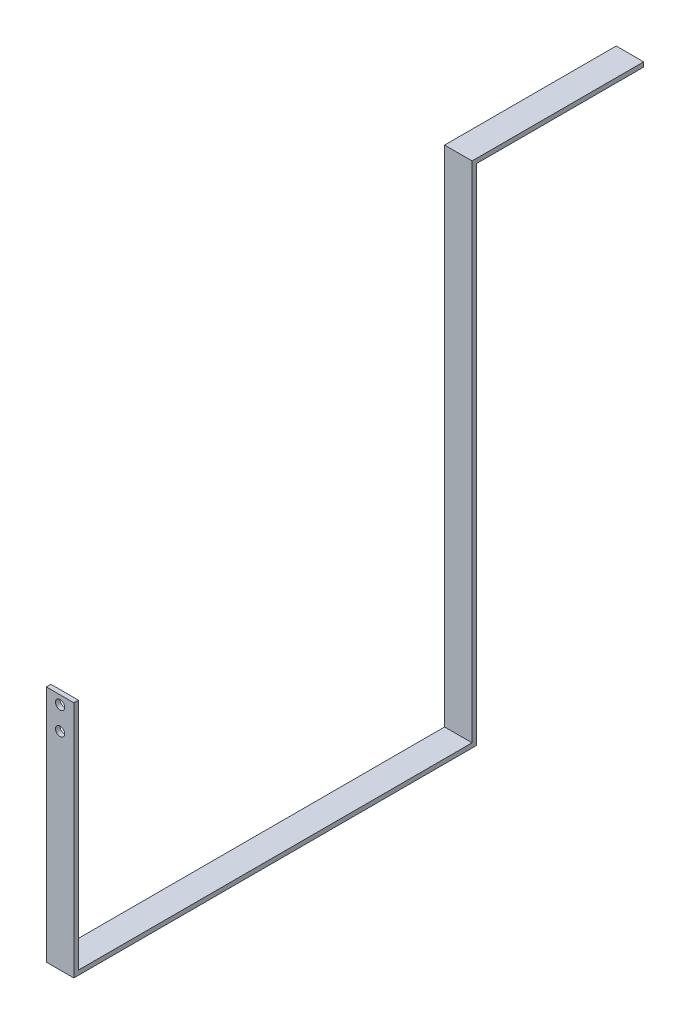
ISO-10303-21;
HEADER;
FILE_DESCRIPTION(('STEP AP214'),'2;1');
FILE_NAME('part.step','',(''),(''),'','','');
FILE_SCHEMA(('AUTOMOTIVE_DESIGN { 1 0 10303 214 1 1 1 1 }'));
ENDSEC;
DATA;
#1=APPLICATION_CONTEXT('core data for automotive mechanical design processes');
#2=APPLICATION_PROTOCOL_DEFINITION('international standard','automotive_design',2000,#1);
#3=PRODUCT_CONTEXT('',#1,'mechanical');
#4=PRODUCT('Part','Part','',(#3));
#5=PRODUCT_RELATED_PRODUCT_CATEGORY('part','',(#4));
#6=PRODUCT_DEFINITION_FORMATION('','',#4);
#7=PRODUCT_DEFINITION_CONTEXT('part definition',#1,'design');
#8=PRODUCT_DEFINITION('design','',#6,#7);
#9=PRODUCT_DEFINITION_SHAPE('','',#8);
#10=(LENGTH_UNIT() NAMED_UNIT(*) SI_UNIT(.MILLI.,.METRE.));
#11=(NAMED_UNIT(*) PLANE_ANGLE_UNIT() SI_UNIT($,.RADIAN.));
#12=(NAMED_UNIT(*) SI_UNIT($,.STERADIAN.) SOLID_ANGLE_UNIT());
#13=UNCERTAINTY_MEASURE_WITH_UNIT(LENGTH_MEASURE(1.E-05),#10,'distance_accuracy_value','');
#14=(GEOMETRIC_REPRESENTATION_CONTEXT(3) GLOBAL_UNCERTAINTY_ASSIGNED_CONTEXT((#13)) GLOBAL_UNIT_ASSIGNED_CONTEXT((#10,
#11,#12)) REPRESENTATION_CONTEXT('',''));
#15=CARTESIAN_POINT('',(0.,0.,0.));
#16=DIRECTION('',(0.,0.,1.));
#17=DIRECTION('',(1.,0.,0.));
#18=AXIS2_PLACEMENT_3D('',#15,#16,#17);
#19=CARTESIAN_POINT('',(19.05,-695.945,790.55));
#20=DIRECTION('',(0.,-1.,0.));
#21=DIRECTION('',(0.,0.,-1.));
#22=AXIS2_PLACEMENT_3D('',#19,#20,#21);
#23=PLANE('',#22);
#24=DIRECTION('',(-1.,0.,0.));
#25=VECTOR('',#24,1.);
#26=CARTESIAN_POINT('',(19.05,-695.945,784.24));
#27=LINE('',#26,#25);
#28=CARTESIAN_POINT('',(19.05,-695.945,784.24));
#29=VERTEX_POINT('',#28);
#30=CARTESIAN_POINT('',(-19.05,-695.945,784.24));
#31=VERTEX_POINT('',#30);
#32=EDGE_CURVE('E143',#29,#31,#27,.T.);
#33=ORIENTED_EDGE('',*,*,#32,.F.);
#34=DIRECTION('',(0.,0.,-1.));
#35=VECTOR('',#34,1.);
#36=CARTESIAN_POINT('',(19.05,-695.945,790.55));
#37=LINE('',#36,#35);
#38=CARTESIAN_POINT('',(19.05,-695.945,238.05));
#39=VERTEX_POINT('',#38);
#40=EDGE_CURVE('E50',#29,#39,#37,.T.);
#41=ORIENTED_EDGE('',*,*,#40,.T.);
#42=DIRECTION('',(-1.,0.,0.));
#43=VECTOR('',#42,1.);
#44=CARTESIAN_POINT('',(19.05,-695.945,238.05));
#45=LINE('',#44,#43);
#46=CARTESIAN_POINT('',(-19.05,-695.945,238.05));
#47=VERTEX_POINT('',#46);
#48=EDGE_CURVE('E128',#39,#47,#45,.T.);
#49=ORIENTED_EDGE('',*,*,#48,.T.);
#50=DIRECTION('',(0.,0.,-1.));
#51=VECTOR('',#50,1.);
#52=CARTESIAN_POINT('',(-19.05,-695.945,790.55));
#53=LINE('',#52,#51);
#54=EDGE_CURVE('E159',#31,#47,#53,.T.);
#55=ORIENTED_EDGE('',*,*,#54,.F.);
#56=EDGE_LOOP('',(#33,#41,#49,#55));
#57=FACE_BOUND('',#56,.T.);
#58=ADVANCED_FACE('F35',(#57),#23,.F.);
#59=CARTESIAN_POINT('',(0.,0.,238.05));
#60=DIRECTION('',(0.,0.,-1.));
#61=DIRECTION('',(-1.,0.,0.));
#62=AXIS2_PLACEMENT_3D('',#59,#60,#61);
#63=PLANE('',#62);
#64=ORIENTED_EDGE('',*,*,#48,.F.);
#65=DIRECTION('',(0.,1.,0.));
#66=VECTOR('',#65,1.);
#67=CARTESIAN_POINT('',(19.05,-3.155,238.05));
#68=LINE('',#67,#66);
#69=CARTESIAN_POINT('',(19.05,3.155,238.05));
#70=VERTEX_POINT('',#69);
#71=EDGE_CURVE('E176',#39,#70,#68,.T.);
#72=ORIENTED_EDGE('',*,*,#71,.T.);
#73=DIRECTION('',(-1.,0.,0.));
#74=VECTOR('',#73,1.);
#75=CARTESIAN_POINT('',(-19.05,3.155,238.05));
#76=LINE('',#75,#74);
#77=CARTESIAN_POINT('',(-19.05,3.155,238.05));
#78=VERTEX_POINT('',#77);
#79=EDGE_CURVE('E178',#70,#78,#76,.T.);
#80=ORIENTED_EDGE('',*,*,#79,.T.);
#81=DIRECTION('',(0.,-1.,0.));
#82=VECTOR('',#81,1.);
#83=CARTESIAN_POINT('',(-19.05,-3.155,238.05));
#84=LINE('',#83,#82);
#85=EDGE_CURVE('E181',#78,#47,#84,.T.);
#86=ORIENTED_EDGE('',*,*,#85,.T.);
#87=EDGE_LOOP('',(#64,#72,#80,#86));
#88=FACE_BOUND('',#87,.T.);
#89=ADVANCED_FACE('F219',(#88),#63,.F.);
#90=CARTESIAN_POINT('',(-19.05,-3.155,238.05));
#91=DIRECTION('',(0.,1.,0.));
#92=DIRECTION('',(0.,0.,1.));
#93=AXIS2_PLACEMENT_3D('',#90,#91,#92);
#94=PLANE('',#93);
#95=DIRECTION('',(1.,0.,0.));
#96=VECTOR('',#95,1.);
#97=CARTESIAN_POINT('',(19.05,-3.155,231.74));
#98=LINE('',#97,#96);
#99=CARTESIAN_POINT('',(-19.05,-3.155,231.74));
#100=VERTEX_POINT('',#99);
#101=CARTESIAN_POINT('',(19.05,-3.155,231.74));
#102=VERTEX_POINT('',#101);
#103=EDGE_CURVE('E58',#100,#102,#98,.T.);
#104=ORIENTED_EDGE('',*,*,#103,.F.);
#105=DIRECTION('',(0.,0.,-1.));
#106=VECTOR('',#105,1.);
#107=CARTESIAN_POINT('',(-19.05,-3.155,238.05));
#108=LINE('',#107,#106);
#109=CARTESIAN_POINT('',(-19.05,-3.155,0.));
#110=VERTEX_POINT('',#109);
#111=EDGE_CURVE('E194',#100,#110,#108,.T.);
#112=ORIENTED_EDGE('',*,*,#111,.T.);
#113=DIRECTION('',(1.,0.,0.));
#114=VECTOR('',#113,1.);
#115=CARTESIAN_POINT('',(-19.05,-3.155,0.));
#116=LINE('',#115,#114);
#117=CARTESIAN_POINT('',(19.05,-3.155,0.));
#118=VERTEX_POINT('',#117);
#119=EDGE_CURVE('E179',#110,#118,#116,.T.);
#120=ORIENTED_EDGE('',*,*,#119,.T.);
#121=DIRECTION('',(0.,0.,-1.));
#122=VECTOR('',#121,1.);
#123=CARTESIAN_POINT('',(19.05,-3.155,238.05));
#124=LINE('',#123,#122);
#125=EDGE_CURVE('E184',#102,#118,#124,.T.);
#126=ORIENTED_EDGE('',*,*,#125,.F.);
#127=EDGE_LOOP('',(#104,#112,#120,#126));
#128=FACE_BOUND('',#127,.T.);
#129=ADVANCED_FACE('F205',(#128),#94,.F.);
#130=CARTESIAN_POINT('',(19.05,-3.155,238.05));
#131=DIRECTION('',(-1.,0.,0.));
#132=DIRECTION('',(0.,0.,1.));
#133=AXIS2_PLACEMENT_3D('',#130,#131,#132);
#134=PLANE('',#133);
#135=DIRECTION('',(0.,1.,0.));
#136=VECTOR('',#135,1.);
#137=CARTESIAN_POINT('',(19.05,-3.155,0.));
#138=LINE('',#137,#136);
#139=CARTESIAN_POINT('',(19.05,3.155,0.));
#140=VERTEX_POINT('',#139);
#141=EDGE_CURVE('E175',#118,#140,#138,.T.);
#142=ORIENTED_EDGE('',*,*,#141,.T.);
#143=DIRECTION('',(0.,0.,-1.));
#144=VECTOR('',#143,1.);
#145=CARTESIAN_POINT('',(19.05,3.155,238.05));
#146=LINE('',#145,#144);
#147=EDGE_CURVE('E11',#70,#140,#146,.T.);
#148=ORIENTED_EDGE('',*,*,#147,.F.);
#149=ORIENTED_EDGE('',*,*,#71,.F.);
#150=ORIENTED_EDGE('',*,*,#40,.F.);
#151=DIRECTION('',(0.,-1.,0.));
#152=VECTOR('',#151,1.);
#153=CARTESIAN_POINT('',(19.05,-371.555,784.24));
#154=LINE('',#153,#152);
#155=CARTESIAN_POINT('',(19.05,-371.555,784.24));
#156=VERTEX_POINT('',#155);
#157=EDGE_CURVE('E155',#156,#29,#154,.T.);
#158=ORIENTED_EDGE('',*,*,#157,.F.);
#159=DIRECTION('',(0.,0.,-1.));
#160=VECTOR('',#159,1.);
#161=CARTESIAN_POINT('',(19.05,-371.555,790.55));
#162=LINE('',#161,#160);
#163=CARTESIAN_POINT('',(19.05,-371.555,790.55));
#164=VERTEX_POINT('',#163);
#165=EDGE_CURVE('E137',#164,#156,#162,.T.);
#166=ORIENTED_EDGE('',*,*,#165,.F.);
#167=DIRECTION('',(0.,1.,0.));
#168=VECTOR('',#167,1.);
#169=CARTESIAN_POINT('',(19.05,-702.255,790.55));
#170=LINE('',#169,#168);
#171=CARTESIAN_POINT('',(19.05,-702.255,790.55));
#172=VERTEX_POINT('',#171);
#173=EDGE_CURVE('E134',#172,#164,#170,.T.);
#174=ORIENTED_EDGE('',*,*,#173,.F.);
#175=DIRECTION('',(0.,0.,1.));
#176=VECTOR('',#175,1.);
#177=CARTESIAN_POINT('',(19.05,-702.255,238.05));
#178=LINE('',#177,#176);
#179=CARTESIAN_POINT('',(19.05,-702.255,231.74));
#180=VERTEX_POINT('',#179);
#181=EDGE_CURVE('E166',#180,#172,#178,.T.);
#182=ORIENTED_EDGE('',*,*,#181,.F.);
#183=DIRECTION('',(0.,1.,0.));
#184=VECTOR('',#183,1.);
#185=CARTESIAN_POINT('',(19.05,-702.255,231.74));
#186=LINE('',#185,#184);
#187=EDGE_CURVE('E168',#180,#102,#186,.T.);
#188=ORIENTED_EDGE('',*,*,#187,.T.);
#189=ORIENTED_EDGE('',*,*,#125,.T.);
#190=EDGE_LOOP('',(#142,#148,#149,#150,#158,#166,#174,#182,#188,#189));
#191=FACE_BOUND('',#190,.T.);
#192=ADVANCED_FACE('F37',(#191),#134,.F.);
#193=CARTESIAN_POINT('',(-19.05,3.155,238.05));
#194=DIRECTION('',(0.,-1.,0.));
#195=DIRECTION('',(0.,0.,-1.));
#196=AXIS2_PLACEMENT_3D('',#193,#194,#195);
#197=PLANE('',#196);
#198=DIRECTION('',(-1.,0.,0.));
#199=VECTOR('',#198,1.);
#200=CARTESIAN_POINT('',(-19.05,3.155,0.));
#201=LINE('',#200,#199);
#202=CARTESIAN_POINT('',(-19.05,3.155,0.));
#203=VERTEX_POINT('',#202);
#204=EDGE_CURVE('E187',#140,#203,#201,.T.);
#205=ORIENTED_EDGE('',*,*,#204,.T.);
#206=DIRECTION('',(0.,0.,-1.));
#207=VECTOR('',#206,1.);
#208=CARTESIAN_POINT('',(-19.05,3.155,238.05));
#209=LINE('',#208,#207);
#210=EDGE_CURVE('E43',#78,#203,#209,.T.);
#211=ORIENTED_EDGE('',*,*,#210,.F.);
#212=ORIENTED_EDGE('',*,*,#79,.F.);
#213=ORIENTED_EDGE('',*,*,#147,.T.);
#214=EDGE_LOOP('',(#205,#211,#212,#213));
#215=FACE_BOUND('',#214,.T.);
#216=ADVANCED_FACE('F221',(#215),#197,.F.);
#217=CARTESIAN_POINT('',(-19.05,-3.155,238.05));
#218=DIRECTION('',(1.,0.,0.));
#219=DIRECTION('',(0.,0.,-1.));
#220=AXIS2_PLACEMENT_3D('',#217,#218,#219);
#221=PLANE('',#220);
#222=DIRECTION('',(0.,-1.,0.));
#223=VECTOR('',#222,1.);
#224=CARTESIAN_POINT('',(-19.05,-3.155,0.));
#225=LINE('',#224,#223);
#226=EDGE_CURVE('E189',#203,#110,#225,.T.);
#227=ORIENTED_EDGE('',*,*,#226,.T.);
#228=ORIENTED_EDGE('',*,*,#111,.F.);
#229=DIRECTION('',(0.,1.,0.));
#230=VECTOR('',#229,1.);
#231=CARTESIAN_POINT('',(-19.05,-702.255,231.74));
#232=LINE('',#231,#230);
#233=CARTESIAN_POINT('',(-19.05,-702.255,231.74));
#234=VERTEX_POINT('',#233);
#235=EDGE_CURVE('E172',#234,#100,#232,.T.);
#236=ORIENTED_EDGE('',*,*,#235,.F.);
#237=DIRECTION('',(0.,0.,-1.));
#238=VECTOR('',#237,1.);
#239=CARTESIAN_POINT('',(-19.05,-702.255,231.74));
#240=LINE('',#239,#238);
#241=CARTESIAN_POINT('',(-19.05,-702.255,790.55));
#242=VERTEX_POINT('',#241);
#243=EDGE_CURVE('E123',#242,#234,#240,.T.);
#244=ORIENTED_EDGE('',*,*,#243,.F.);
#245=DIRECTION('',(0.,-1.,0.));
#246=VECTOR('',#245,1.);
#247=CARTESIAN_POINT('',(-19.05,-695.945,790.55));
#248=LINE('',#247,#246);
#249=CARTESIAN_POINT('',(-19.05,-371.555,790.55));
#250=VERTEX_POINT('',#249);
#251=EDGE_CURVE('E114',#250,#242,#248,.T.);
#252=ORIENTED_EDGE('',*,*,#251,.F.);
#253=DIRECTION('',(0.,0.,1.));
#254=VECTOR('',#253,1.);
#255=CARTESIAN_POINT('',(-19.05,-371.555,784.24));
#256=LINE('',#255,#254);
#257=CARTESIAN_POINT('',(-19.05,-371.555,784.24));
#258=VERTEX_POINT('',#257);
#259=EDGE_CURVE('E120',#258,#250,#256,.T.);
#260=ORIENTED_EDGE('',*,*,#259,.F.);
#261=DIRECTION('',(0.,-1.,0.));
#262=VECTOR('',#261,1.);
#263=CARTESIAN_POINT('',(-19.05,-371.555,784.24));
#264=LINE('',#263,#262);
#265=EDGE_CURVE('E152',#258,#31,#264,.T.);
#266=ORIENTED_EDGE('',*,*,#265,.T.);
#267=ORIENTED_EDGE('',*,*,#54,.T.);
#268=ORIENTED_EDGE('',*,*,#85,.F.);
#269=ORIENTED_EDGE('',*,*,#210,.T.);
#270=EDGE_LOOP('',(#227,#228,#236,#244,#252,#260,#266,#267,#268,#269));
#271=FACE_BOUND('',#270,.T.);
#272=ADVANCED_FACE('F117',(#271),#221,.F.);
#273=CARTESIAN_POINT('',(0.,0.,0.));
#274=DIRECTION('',(0.,0.,-1.));
#275=DIRECTION('',(-1.,0.,0.));
#276=AXIS2_PLACEMENT_3D('',#273,#274,#275);
#277=PLANE('',#276);
#278=ORIENTED_EDGE('',*,*,#141,.F.);
#279=ORIENTED_EDGE('',*,*,#119,.F.);
#280=ORIENTED_EDGE('',*,*,#226,.F.);
#281=ORIENTED_EDGE('',*,*,#204,.F.);
#282=EDGE_LOOP('',(#278,#279,#280,#281));
#283=FACE_BOUND('',#282,.T.);
#284=ADVANCED_FACE('F204',(#283),#277,.T.);
#285=CARTESIAN_POINT('',(19.05,-702.255,231.74));
#286=DIRECTION('',(0.,0.,1.));
#287=DIRECTION('',(1.,0.,0.));
#288=AXIS2_PLACEMENT_3D('',#285,#286,#287);
#289=PLANE('',#288);
#290=ORIENTED_EDGE('',*,*,#103,.T.);
#291=ORIENTED_EDGE('',*,*,#187,.F.);
#292=DIRECTION('',(1.,0.,0.));
#293=VECTOR('',#292,1.);
#294=CARTESIAN_POINT('',(19.05,-702.255,231.74));
#295=LINE('',#294,#293);
#296=EDGE_CURVE('E164',#234,#180,#295,.T.);
#297=ORIENTED_EDGE('',*,*,#296,.F.);
#298=ORIENTED_EDGE('',*,*,#235,.T.);
#299=EDGE_LOOP('',(#290,#291,#297,#298));
#300=FACE_BOUND('',#299,.T.);
#301=ADVANCED_FACE('F207',(#300),#289,.F.);
#302=CARTESIAN_POINT('',(0.,-702.255,0.));
#303=DIRECTION('',(0.,1.,0.));
#304=DIRECTION('',(0.,0.,1.));
#305=AXIS2_PLACEMENT_3D('',#302,#303,#304);
#306=PLANE('',#305);
#307=ORIENTED_EDGE('',*,*,#243,.T.);
#308=ORIENTED_EDGE('',*,*,#296,.T.);
#309=ORIENTED_EDGE('',*,*,#181,.T.);
#310=DIRECTION('',(1.,0.,0.));
#311=VECTOR('',#310,1.);
#312=CARTESIAN_POINT('',(-19.05,-702.255,790.55));
#313=LINE('',#312,#311);
#314=EDGE_CURVE('E127',#242,#172,#313,.T.);
#315=ORIENTED_EDGE('',*,*,#314,.F.);
#316=EDGE_LOOP('',(#307,#308,#309,#315));
#317=FACE_BOUND('',#316,.T.);
#318=ADVANCED_FACE('F211',(#317),#306,.F.);
#319=CARTESIAN_POINT('',(0.,0.,790.55));
#320=DIRECTION('',(0.,0.,1.));
#321=DIRECTION('',(1.,0.,0.));
#322=AXIS2_PLACEMENT_3D('',#319,#320,#321);
#323=PLANE('',#322);
#324=CARTESIAN_POINT('',(2.04003480774873E-12,-415.44720466572,790.55));
#325=DIRECTION('',(0.,0.,1.));
#326=DIRECTION('',(1.,0.,0.));
#327=AXIS2_PLACEMENT_3D('',#324,#325,#326);
#328=CIRCLE('',#327,6.35);
#329=CARTESIAN_POINT('',(6.35000000000204,-415.44720466572,790.55));
#330=VERTEX_POINT('',#329);
#331=EDGE_CURVE('E320',#330,#330,#328,.T.);
#332=ORIENTED_EDGE('',*,*,#331,.F.);
#333=EDGE_LOOP('',(#332));
#334=FACE_BOUND('',#333,.T.);
#335=CARTESIAN_POINT('',(2.02615701994091E-12,-383.44720466572,790.55));
#336=DIRECTION('',(0.,0.,1.));
#337=DIRECTION('',(1.,0.,0.));
#338=AXIS2_PLACEMENT_3D('',#335,#336,#337);
#339=CIRCLE('',#338,6.34999999999997);
#340=CARTESIAN_POINT('',(6.35000000000199,-383.44720466572,790.55));
#341=VERTEX_POINT('',#340);
#342=EDGE_CURVE('E148',#341,#341,#339,.T.);
#343=ORIENTED_EDGE('',*,*,#342,.F.);
#344=EDGE_LOOP('',(#343));
#345=FACE_BOUND('',#344,.T.);
#346=ORIENTED_EDGE('',*,*,#251,.T.);
#347=ORIENTED_EDGE('',*,*,#314,.T.);
#348=ORIENTED_EDGE('',*,*,#173,.T.);
#349=DIRECTION('',(1.,0.,0.));
#350=VECTOR('',#349,1.);
#351=CARTESIAN_POINT('',(-19.05,-371.555,790.55));
#352=LINE('',#351,#350);
#353=EDGE_CURVE('E131',#250,#164,#352,.T.);
#354=ORIENTED_EDGE('',*,*,#353,.F.);
#355=EDGE_LOOP('',(#346,#347,#348,#354));
#356=FACE_BOUND('',#355,.T.);
#357=ADVANCED_FACE('F132',(#334,#345,#356),#323,.T.);
#358=CARTESIAN_POINT('',(19.05,-371.555,784.24));
#359=DIRECTION('',(0.,0.,1.));
#360=DIRECTION('',(1.,0.,0.));
#361=AXIS2_PLACEMENT_3D('',#358,#359,#360);
#362=PLANE('',#361);
#363=CARTESIAN_POINT('',(2.04003480774873E-12,-415.44720466572,784.24));
#364=DIRECTION('',(0.,0.,1.));
#365=DIRECTION('',(1.,0.,0.));
#366=AXIS2_PLACEMENT_3D('',#363,#364,#365);
#367=CIRCLE('',#366,6.35);
#368=CARTESIAN_POINT('',(6.35000000000204,-415.44720466572,784.24));
#369=VERTEX_POINT('',#368);
#370=EDGE_CURVE('E317',#369,#369,#367,.T.);
#371=ORIENTED_EDGE('',*,*,#370,.T.);
#372=EDGE_LOOP('',(#371));
#373=FACE_BOUND('',#372,.T.);
#374=CARTESIAN_POINT('',(2.02615701994091E-12,-383.44720466572,784.24));
#375=DIRECTION('',(0.,0.,1.));
#376=DIRECTION('',(1.,0.,0.));
#377=AXIS2_PLACEMENT_3D('',#374,#375,#376);
#378=CIRCLE('',#377,6.34999999999997);
#379=CARTESIAN_POINT('',(6.35000000000199,-383.44720466572,784.24));
#380=VERTEX_POINT('',#379);
#381=EDGE_CURVE('E145',#380,#380,#378,.T.);
#382=ORIENTED_EDGE('',*,*,#381,.T.);
#383=EDGE_LOOP('',(#382));
#384=FACE_BOUND('',#383,.T.);
#385=ORIENTED_EDGE('',*,*,#32,.T.);
#386=ORIENTED_EDGE('',*,*,#265,.F.);
#387=DIRECTION('',(-1.,0.,0.));
#388=VECTOR('',#387,1.);
#389=CARTESIAN_POINT('',(19.05,-371.555,784.24));
#390=LINE('',#389,#388);
#391=EDGE_CURVE('E141',#156,#258,#390,.T.);
#392=ORIENTED_EDGE('',*,*,#391,.F.);
#393=ORIENTED_EDGE('',*,*,#157,.T.);
#394=EDGE_LOOP('',(#385,#386,#392,#393));
#395=FACE_BOUND('',#394,.T.);
#396=ADVANCED_FACE('F216',(#373,#384,#395),#362,.F.);
#397=CARTESIAN_POINT('',(0.,-371.555,0.));
#398=DIRECTION('',(0.,1.,0.));
#399=DIRECTION('',(0.,0.,1.));
#400=AXIS2_PLACEMENT_3D('',#397,#398,#399);
#401=PLANE('',#400);
#402=ORIENTED_EDGE('',*,*,#259,.T.);
#403=ORIENTED_EDGE('',*,*,#353,.T.);
#404=ORIENTED_EDGE('',*,*,#165,.T.);
#405=ORIENTED_EDGE('',*,*,#391,.T.);
#406=EDGE_LOOP('',(#402,#403,#404,#405));
#407=FACE_BOUND('',#406,.T.);
#408=ADVANCED_FACE('F139',(#407),#401,.T.);
#409=CARTESIAN_POINT('',(2.02615701994091E-12,-383.44720466572,784.24));
#410=DIRECTION('',(0.,0.,1.));
#411=DIRECTION('',(1.,0.,0.));
#412=AXIS2_PLACEMENT_3D('',#409,#410,#411);
#413=CYLINDRICAL_SURFACE('',#412,6.34999999999997);
#414=ORIENTED_EDGE('',*,*,#381,.F.);
#415=EDGE_LOOP('',(#414));
#416=FACE_BOUND('',#415,.T.);
#417=ORIENTED_EDGE('',*,*,#342,.T.);
#418=EDGE_LOOP('',(#417));
#419=FACE_BOUND('',#418,.T.);
#420=ADVANCED_FACE('F275',(#416,#419),#413,.F.);
#421=CARTESIAN_POINT('',(2.04003480774873E-12,-415.44720466572,784.24));
#422=DIRECTION('',(0.,0.,1.));
#423=DIRECTION('',(1.,0.,0.));
#424=AXIS2_PLACEMENT_3D('',#421,#422,#423);
#425=CYLINDRICAL_SURFACE('',#424,6.35);
#426=ORIENTED_EDGE('',*,*,#370,.F.);
#427=EDGE_LOOP('',(#426));
#428=FACE_BOUND('',#427,.T.);
#429=ORIENTED_EDGE('',*,*,#331,.T.);
#430=EDGE_LOOP('',(#429));
#431=FACE_BOUND('',#430,.T.);
#432=ADVANCED_FACE('F300',(#428,#431),#425,.F.);
#433=CLOSED_SHELL('',(#58,#89,#129,#192,#216,#272,#284,#301,#318,#357,#396,#408,#420,#432));
#434=MANIFOLD_SOLID_BREP('B2',#433);
#435=ADVANCED_BREP_SHAPE_REPRESENTATION('',(#18,#434),#14);
#436=SHAPE_DEFINITION_REPRESENTATION(#9,#435);
ENDSEC;
END-ISO-10303-21;
